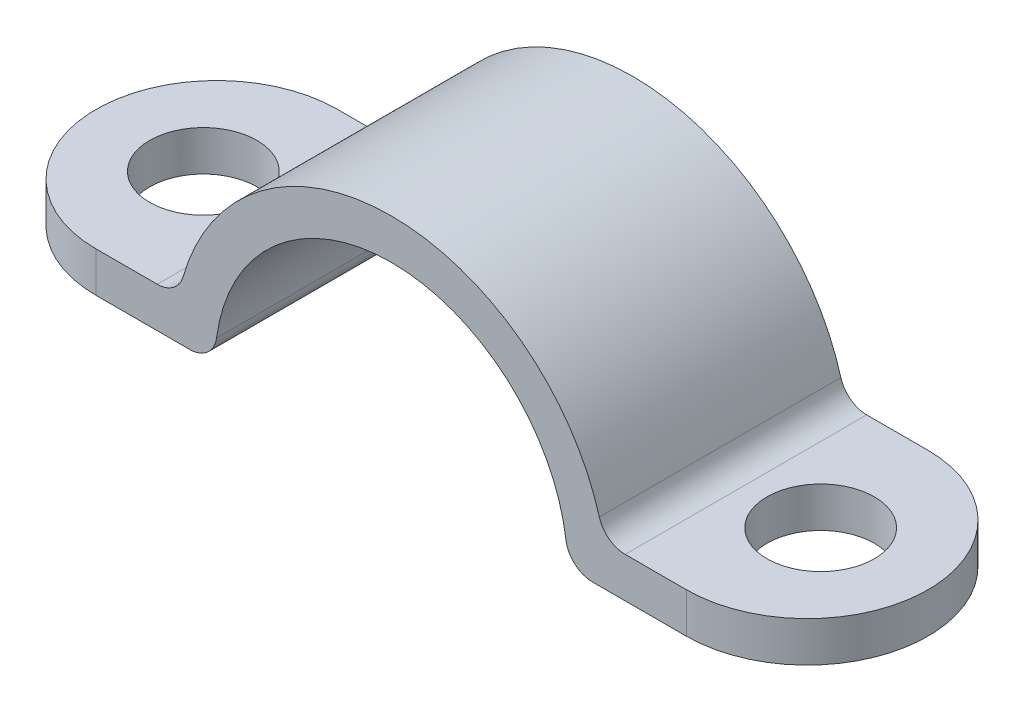
ISO-10303-21;
HEADER;
FILE_DESCRIPTION(('STEP AP214'),'2;1');
FILE_NAME('part.step','',(''),(''),'','','');
FILE_SCHEMA(('AUTOMOTIVE_DESIGN { 1 0 10303 214 1 1 1 1 }'));
ENDSEC;
DATA;
#1=APPLICATION_CONTEXT('core data for automotive mechanical design processes');
#2=APPLICATION_PROTOCOL_DEFINITION('international standard','automotive_design',2000,#1);
#3=PRODUCT_CONTEXT('',#1,'mechanical');
#4=PRODUCT('Part','Part','',(#3));
#5=PRODUCT_RELATED_PRODUCT_CATEGORY('part','',(#4));
#6=PRODUCT_DEFINITION_FORMATION('','',#4);
#7=PRODUCT_DEFINITION_CONTEXT('part definition',#1,'design');
#8=PRODUCT_DEFINITION('design','',#6,#7);
#9=PRODUCT_DEFINITION_SHAPE('','',#8);
#10=(LENGTH_UNIT() NAMED_UNIT(*) SI_UNIT(.MILLI.,.METRE.));
#11=(NAMED_UNIT(*) PLANE_ANGLE_UNIT() SI_UNIT($,.RADIAN.));
#12=(NAMED_UNIT(*) SI_UNIT($,.STERADIAN.) SOLID_ANGLE_UNIT());
#13=UNCERTAINTY_MEASURE_WITH_UNIT(LENGTH_MEASURE(1.E-05),#10,'distance_accuracy_value','');
#14=(GEOMETRIC_REPRESENTATION_CONTEXT(3) GLOBAL_UNCERTAINTY_ASSIGNED_CONTEXT((#13)) GLOBAL_UNIT_ASSIGNED_CONTEXT((#10,
#11,#12)) REPRESENTATION_CONTEXT('',''));
#15=CARTESIAN_POINT('',(0.,0.,0.));
#16=DIRECTION('',(0.,0.,1.));
#17=DIRECTION('',(1.,0.,0.));
#18=AXIS2_PLACEMENT_3D('',#15,#16,#17);
#19=CARTESIAN_POINT('',(22.,0.,9.));
#20=DIRECTION('',(0.,1.,0.));
#21=DIRECTION('',(0.,0.,1.));
#22=AXIS2_PLACEMENT_3D('',#19,#20,#21);
#23=CYLINDRICAL_SURFACE('',#22,9.);
#24=DIRECTION('',(0.,1.,0.));
#25=VECTOR('',#24,1.);
#26=CARTESIAN_POINT('',(22.,5.,18.));
#27=LINE('',#26,#25);
#28=CARTESIAN_POINT('',(22.,0.,18.));
#29=VERTEX_POINT('',#28);
#30=CARTESIAN_POINT('',(22.,3.,18.));
#31=VERTEX_POINT('',#30);
#32=EDGE_CURVE('E165',#29,#31,#27,.T.);
#33=ORIENTED_EDGE('',*,*,#32,.F.);
#34=CARTESIAN_POINT('',(22.,0.,9.));
#35=DIRECTION('',(0.,-1.,0.));
#36=DIRECTION('',(1.,0.,0.));
#37=AXIS2_PLACEMENT_3D('',#34,#35,#36);
#38=CIRCLE('',#37,9.);
#39=CARTESIAN_POINT('',(22.,0.,0.));
#40=VERTEX_POINT('',#39);
#41=EDGE_CURVE('E46',#40,#29,#38,.T.);
#42=ORIENTED_EDGE('',*,*,#41,.F.);
#43=DIRECTION('',(0.,-1.,0.));
#44=VECTOR('',#43,1.);
#45=CARTESIAN_POINT('',(22.,0.,0.));
#46=LINE('',#45,#44);
#47=CARTESIAN_POINT('',(22.,3.,0.));
#48=VERTEX_POINT('',#47);
#49=EDGE_CURVE('E167',#48,#40,#46,.T.);
#50=ORIENTED_EDGE('',*,*,#49,.F.);
#51=CARTESIAN_POINT('',(22.,3.,9.));
#52=DIRECTION('',(0.,-1.,0.));
#53=DIRECTION('',(1.,0.,0.));
#54=AXIS2_PLACEMENT_3D('',#51,#52,#53);
#55=CIRCLE('',#54,9.);
#56=EDGE_CURVE('E11',#31,#48,#55,.F.);
#57=ORIENTED_EDGE('',*,*,#56,.F.);
#58=EDGE_LOOP('',(#33,#42,#50,#57));
#59=FACE_BOUND('',#58,.T.);
#60=ADVANCED_FACE('F38',(#59),#23,.T.);
#61=CARTESIAN_POINT('',(-22.,0.,9.));
#62=DIRECTION('',(0.,1.,0.));
#63=DIRECTION('',(0.,0.,1.));
#64=AXIS2_PLACEMENT_3D('',#61,#62,#63);
#65=CYLINDRICAL_SURFACE('',#64,9.);
#66=DIRECTION('',(0.,1.,0.));
#67=VECTOR('',#66,1.);
#68=CARTESIAN_POINT('',(-22.,5.,0.));
#69=LINE('',#68,#67);
#70=CARTESIAN_POINT('',(-22.,0.,0.));
#71=VERTEX_POINT('',#70);
#72=CARTESIAN_POINT('',(-22.,3.,0.));
#73=VERTEX_POINT('',#72);
#74=EDGE_CURVE('E150',#71,#73,#69,.T.);
#75=ORIENTED_EDGE('',*,*,#74,.F.);
#76=CARTESIAN_POINT('',(-22.,0.,9.));
#77=DIRECTION('',(0.,-1.,0.));
#78=DIRECTION('',(0.,0.,-1.));
#79=AXIS2_PLACEMENT_3D('',#76,#77,#78);
#80=CIRCLE('',#79,9.);
#81=CARTESIAN_POINT('',(-22.,0.,18.));
#82=VERTEX_POINT('',#81);
#83=EDGE_CURVE('E161',#82,#71,#80,.T.);
#84=ORIENTED_EDGE('',*,*,#83,.F.);
#85=DIRECTION('',(0.,-1.,0.));
#86=VECTOR('',#85,1.);
#87=CARTESIAN_POINT('',(-22.,0.,18.));
#88=LINE('',#87,#86);
#89=CARTESIAN_POINT('',(-22.,3.,18.));
#90=VERTEX_POINT('',#89);
#91=EDGE_CURVE('E153',#90,#82,#88,.T.);
#92=ORIENTED_EDGE('',*,*,#91,.F.);
#93=CARTESIAN_POINT('',(-22.,3.,9.));
#94=DIRECTION('',(0.,-1.,0.));
#95=DIRECTION('',(1.,0.,0.));
#96=AXIS2_PLACEMENT_3D('',#93,#94,#95);
#97=CIRCLE('',#96,9.);
#98=EDGE_CURVE('E163',#73,#90,#97,.F.);
#99=ORIENTED_EDGE('',*,*,#98,.F.);
#100=EDGE_LOOP('',(#75,#84,#92,#99));
#101=FACE_BOUND('',#100,.T.);
#102=ADVANCED_FACE('F234',(#101),#65,.T.);
#103=CARTESIAN_POINT('',(17.4297583374678,5.,18.));
#104=DIRECTION('',(0.,0.,-1.));
#105=DIRECTION('',(-1.,0.,0.));
#106=AXIS2_PLACEMENT_3D('',#103,#104,#105);
#107=CYLINDRICAL_SURFACE('',#106,2.);
#108=CARTESIAN_POINT('',(17.4297583374678,5.,0.));
#109=DIRECTION('',(0.,0.,-1.));
#110=DIRECTION('',(-1.,0.,0.));
#111=AXIS2_PLACEMENT_3D('',#108,#109,#110);
#112=CIRCLE('',#111,2.);
#113=CARTESIAN_POINT('',(17.4297583374678,3.,0.));
#114=VERTEX_POINT('',#113);
#115=CARTESIAN_POINT('',(15.5072962475975,4.44851154770811,0.));
#116=VERTEX_POINT('',#115);
#117=EDGE_CURVE('E149',#114,#116,#112,.T.);
#118=ORIENTED_EDGE('',*,*,#117,.T.);
#119=DIRECTION('',(0.,0.,-1.));
#120=VECTOR('',#119,1.);
#121=CARTESIAN_POINT('',(15.5072962475975,4.44851154770811,18.));
#122=LINE('',#121,#120);
#123=CARTESIAN_POINT('',(15.5072962475975,4.44851154770811,18.));
#124=VERTEX_POINT('',#123);
#125=EDGE_CURVE('E128',#124,#116,#122,.T.);
#126=ORIENTED_EDGE('',*,*,#125,.F.);
#127=CARTESIAN_POINT('',(17.4297583374678,5.,18.));
#128=DIRECTION('',(0.,0.,-1.));
#129=DIRECTION('',(-1.,0.,0.));
#130=AXIS2_PLACEMENT_3D('',#127,#128,#129);
#131=CIRCLE('',#130,2.);
#132=CARTESIAN_POINT('',(17.4297583374678,3.,18.));
#133=VERTEX_POINT('',#132);
#134=EDGE_CURVE('E135',#133,#124,#131,.T.);
#135=ORIENTED_EDGE('',*,*,#134,.F.);
#136=DIRECTION('',(0.,0.,-1.));
#137=VECTOR('',#136,1.);
#138=CARTESIAN_POINT('',(17.4297583374678,3.,18.));
#139=LINE('',#138,#137);
#140=EDGE_CURVE('E180',#133,#114,#139,.T.);
#141=ORIENTED_EDGE('',*,*,#140,.T.);
#142=EDGE_LOOP('',(#118,#126,#135,#141));
#143=FACE_BOUND('',#142,.T.);
#144=ADVANCED_FACE('F147',(#143),#107,.F.);
#145=CARTESIAN_POINT('',(0.,0.,18.));
#146=DIRECTION('',(0.,0.,-1.));
#147=DIRECTION('',(-1.,0.,0.));
#148=AXIS2_PLACEMENT_3D('',#145,#146,#147);
#149=CYLINDRICAL_SURFACE('',#148,16.1327459504216);
#150=CARTESIAN_POINT('',(0.,0.,0.));
#151=DIRECTION('',(0.,0.,1.));
#152=DIRECTION('',(1.,0.,0.));
#153=AXIS2_PLACEMENT_3D('',#150,#151,#152);
#154=CIRCLE('',#153,16.1327459504216);
#155=CARTESIAN_POINT('',(-15.5072962475975,4.44851154770811,0.));
#156=VERTEX_POINT('',#155);
#157=EDGE_CURVE('E187',#116,#156,#154,.T.);
#158=ORIENTED_EDGE('',*,*,#157,.T.);
#159=DIRECTION('',(0.,0.,-1.));
#160=VECTOR('',#159,1.);
#161=CARTESIAN_POINT('',(-15.5072962475975,4.44851154770811,18.));
#162=LINE('',#161,#160);
#163=CARTESIAN_POINT('',(-15.5072962475975,4.44851154770811,18.));
#164=VERTEX_POINT('',#163);
#165=EDGE_CURVE('E131',#164,#156,#162,.T.);
#166=ORIENTED_EDGE('',*,*,#165,.F.);
#167=CARTESIAN_POINT('',(0.,0.,18.));
#168=DIRECTION('',(0.,0.,1.));
#169=DIRECTION('',(1.,0.,0.));
#170=AXIS2_PLACEMENT_3D('',#167,#168,#169);
#171=CIRCLE('',#170,16.1327459504216);
#172=EDGE_CURVE('E124',#124,#164,#171,.T.);
#173=ORIENTED_EDGE('',*,*,#172,.F.);
#174=ORIENTED_EDGE('',*,*,#125,.T.);
#175=EDGE_LOOP('',(#158,#166,#173,#174));
#176=FACE_BOUND('',#175,.T.);
#177=ADVANCED_FACE('F126',(#176),#149,.T.);
#178=CARTESIAN_POINT('',(-17.4297583374678,5.,18.));
#179=DIRECTION('',(0.,0.,-1.));
#180=DIRECTION('',(-1.,0.,0.));
#181=AXIS2_PLACEMENT_3D('',#178,#179,#180);
#182=CYLINDRICAL_SURFACE('',#181,2.);
#183=CARTESIAN_POINT('',(-17.4297583374678,5.,0.));
#184=DIRECTION('',(0.,0.,-1.));
#185=DIRECTION('',(-1.,0.,0.));
#186=AXIS2_PLACEMENT_3D('',#183,#184,#185);
#187=CIRCLE('',#186,2.);
#188=CARTESIAN_POINT('',(-17.4297583374678,3.,0.));
#189=VERTEX_POINT('',#188);
#190=EDGE_CURVE('E190',#156,#189,#187,.T.);
#191=ORIENTED_EDGE('',*,*,#190,.T.);
#192=DIRECTION('',(0.,0.,-1.));
#193=VECTOR('',#192,1.);
#194=CARTESIAN_POINT('',(-17.4297583374678,3.,18.));
#195=LINE('',#194,#193);
#196=CARTESIAN_POINT('',(-17.4297583374678,3.,18.));
#197=VERTEX_POINT('',#196);
#198=EDGE_CURVE('E155',#197,#189,#195,.T.);
#199=ORIENTED_EDGE('',*,*,#198,.F.);
#200=CARTESIAN_POINT('',(-17.4297583374678,5.,18.));
#201=DIRECTION('',(0.,0.,-1.));
#202=DIRECTION('',(-1.,0.,0.));
#203=AXIS2_PLACEMENT_3D('',#200,#201,#202);
#204=CIRCLE('',#203,2.);
#205=EDGE_CURVE('E134',#164,#197,#204,.T.);
#206=ORIENTED_EDGE('',*,*,#205,.F.);
#207=ORIENTED_EDGE('',*,*,#165,.T.);
#208=EDGE_LOOP('',(#191,#199,#206,#207));
#209=FACE_BOUND('',#208,.T.);
#210=ADVANCED_FACE('F280',(#209),#182,.F.);
#211=CARTESIAN_POINT('',(-17.4297583374678,3.,18.));
#212=DIRECTION('',(0.,-1.,0.));
#213=DIRECTION('',(1.,0.,0.));
#214=AXIS2_PLACEMENT_3D('',#211,#212,#213);
#215=PLANE('',#214);
#216=CARTESIAN_POINT('',(-23.,3.,9.00000000000001));
#217=DIRECTION('',(0.,1.,0.));
#218=DIRECTION('',(-1.,0.,0.));
#219=AXIS2_PLACEMENT_3D('',#216,#217,#218);
#220=CIRCLE('',#219,4.);
#221=CARTESIAN_POINT('',(-27.,3.,9.00000000000001));
#222=VERTEX_POINT('',#221);
#223=EDGE_CURVE('E188',#222,#222,#220,.T.);
#224=ORIENTED_EDGE('',*,*,#223,.F.);
#225=EDGE_LOOP('',(#224));
#226=FACE_BOUND('',#225,.T.);
#227=DIRECTION('',(-1.,0.,0.));
#228=VECTOR('',#227,1.);
#229=CARTESIAN_POINT('',(-17.4297583374678,3.,0.));
#230=LINE('',#229,#228);
#231=EDGE_CURVE('E192',#189,#73,#230,.T.);
#232=ORIENTED_EDGE('',*,*,#231,.T.);
#233=ORIENTED_EDGE('',*,*,#98,.T.);
#234=DIRECTION('',(-1.,0.,0.));
#235=VECTOR('',#234,1.);
#236=CARTESIAN_POINT('',(-17.4297583374678,3.,18.));
#237=LINE('',#236,#235);
#238=EDGE_CURVE('E224',#197,#90,#237,.T.);
#239=ORIENTED_EDGE('',*,*,#238,.F.);
#240=ORIENTED_EDGE('',*,*,#198,.T.);
#241=EDGE_LOOP('',(#232,#233,#239,#240));
#242=FACE_BOUND('',#241,.T.);
#243=ADVANCED_FACE('F222',(#226,#242),#215,.F.);
#244=CARTESIAN_POINT('',(-15.,0.,18.));
#245=DIRECTION('',(0.,-1.,0.));
#246=DIRECTION('',(0.,0.,-1.));
#247=AXIS2_PLACEMENT_3D('',#244,#245,#246);
#248=PLANE('',#247);
#249=CARTESIAN_POINT('',(-23.,0.,9.00000000000001));
#250=DIRECTION('',(0.,-1.,0.));
#251=DIRECTION('',(0.,0.,-1.));
#252=AXIS2_PLACEMENT_3D('',#249,#250,#251);
#253=CIRCLE('',#252,4.);
#254=CARTESIAN_POINT('',(-23.,0.,5.00000000000001));
#255=VERTEX_POINT('',#254);
#256=EDGE_CURVE('E399',#255,#255,#253,.F.);
#257=ORIENTED_EDGE('',*,*,#256,.T.);
#258=EDGE_LOOP('',(#257));
#259=FACE_BOUND('',#258,.T.);
#260=DIRECTION('',(-1.,0.,0.));
#261=VECTOR('',#260,1.);
#262=CARTESIAN_POINT('',(-15.,0.,18.));
#263=LINE('',#262,#261);
#264=CARTESIAN_POINT('',(-15.,0.,18.));
#265=VERTEX_POINT('',#264);
#266=EDGE_CURVE('E238',#265,#82,#263,.T.);
#267=ORIENTED_EDGE('',*,*,#266,.T.);
#268=ORIENTED_EDGE('',*,*,#83,.T.);
#269=DIRECTION('',(-1.,0.,0.));
#270=VECTOR('',#269,1.);
#271=CARTESIAN_POINT('',(-15.,0.,0.));
#272=LINE('',#271,#270);
#273=CARTESIAN_POINT('',(-15.,0.,0.));
#274=VERTEX_POINT('',#273);
#275=EDGE_CURVE('E195',#274,#71,#272,.T.);
#276=ORIENTED_EDGE('',*,*,#275,.F.);
#277=DIRECTION('',(0.,0.,-1.));
#278=VECTOR('',#277,1.);
#279=CARTESIAN_POINT('',(-15.,0.,18.));
#280=LINE('',#279,#278);
#281=EDGE_CURVE('E216',#265,#274,#280,.T.);
#282=ORIENTED_EDGE('',*,*,#281,.F.);
#283=EDGE_LOOP('',(#267,#268,#276,#282));
#284=FACE_BOUND('',#283,.T.);
#285=ADVANCED_FACE('F285',(#259,#284),#248,.T.);
#286=CARTESIAN_POINT('',(-15.,2.,18.));
#287=DIRECTION('',(0.,0.,-1.));
#288=DIRECTION('',(-1.,0.,0.));
#289=AXIS2_PLACEMENT_3D('',#286,#287,#288);
#290=CYLINDRICAL_SURFACE('',#289,2.);
#291=CARTESIAN_POINT('',(-15.,2.,0.));
#292=DIRECTION('',(0.,0.,1.));
#293=DIRECTION('',(1.,0.,0.));
#294=AXIS2_PLACEMENT_3D('',#291,#292,#293);
#295=CIRCLE('',#294,2.);
#296=CARTESIAN_POINT('',(-13.0175441986347,1.73567255981796,0.));
#297=VERTEX_POINT('',#296);
#298=EDGE_CURVE('E198',#274,#297,#295,.T.);
#299=ORIENTED_EDGE('',*,*,#298,.T.);
#300=DIRECTION('',(0.,0.,-1.));
#301=VECTOR('',#300,1.);
#302=CARTESIAN_POINT('',(-13.0175441986347,1.73567255981796,18.));
#303=LINE('',#302,#301);
#304=CARTESIAN_POINT('',(-13.0175441986347,1.73567255981796,18.));
#305=VERTEX_POINT('',#304);
#306=EDGE_CURVE('E214',#305,#297,#303,.T.);
#307=ORIENTED_EDGE('',*,*,#306,.F.);
#308=CARTESIAN_POINT('',(-15.,2.,18.));
#309=DIRECTION('',(0.,0.,1.));
#310=DIRECTION('',(1.,0.,0.));
#311=AXIS2_PLACEMENT_3D('',#308,#309,#310);
#312=CIRCLE('',#311,2.);
#313=EDGE_CURVE('E240',#265,#305,#312,.T.);
#314=ORIENTED_EDGE('',*,*,#313,.F.);
#315=ORIENTED_EDGE('',*,*,#281,.T.);
#316=EDGE_LOOP('',(#299,#307,#314,#315));
#317=FACE_BOUND('',#316,.T.);
#318=ADVANCED_FACE('F289',(#317),#290,.T.);
#319=CARTESIAN_POINT('',(0.,0.,18.));
#320=DIRECTION('',(0.,0.,-1.));
#321=DIRECTION('',(-1.,0.,0.));
#322=AXIS2_PLACEMENT_3D('',#319,#320,#321);
#323=CYLINDRICAL_SURFACE('',#322,13.1327459504216);
#324=CARTESIAN_POINT('',(0.,0.,0.));
#325=DIRECTION('',(0.,0.,1.));
#326=DIRECTION('',(1.,0.,0.));
#327=AXIS2_PLACEMENT_3D('',#324,#325,#326);
#328=CIRCLE('',#327,13.1327459504216);
#329=CARTESIAN_POINT('',(13.0175441986347,1.73567255981796,0.));
#330=VERTEX_POINT('',#329);
#331=EDGE_CURVE('E201',#330,#297,#328,.T.);
#332=ORIENTED_EDGE('',*,*,#331,.F.);
#333=DIRECTION('',(0.,0.,-1.));
#334=VECTOR('',#333,1.);
#335=CARTESIAN_POINT('',(13.0175441986347,1.73567255981796,18.));
#336=LINE('',#335,#334);
#337=CARTESIAN_POINT('',(13.0175441986347,1.73567255981796,18.));
#338=VERTEX_POINT('',#337);
#339=EDGE_CURVE('E212',#338,#330,#336,.T.);
#340=ORIENTED_EDGE('',*,*,#339,.F.);
#341=CARTESIAN_POINT('',(0.,0.,18.));
#342=DIRECTION('',(0.,0.,1.));
#343=DIRECTION('',(1.,0.,0.));
#344=AXIS2_PLACEMENT_3D('',#341,#342,#343);
#345=CIRCLE('',#344,13.1327459504216);
#346=EDGE_CURVE('E182',#338,#305,#345,.T.);
#347=ORIENTED_EDGE('',*,*,#346,.T.);
#348=ORIENTED_EDGE('',*,*,#306,.T.);
#349=EDGE_LOOP('',(#332,#340,#347,#348));
#350=FACE_BOUND('',#349,.T.);
#351=ADVANCED_FACE('F247',(#350),#323,.F.);
#352=CARTESIAN_POINT('',(15.,2.,18.));
#353=DIRECTION('',(0.,0.,-1.));
#354=DIRECTION('',(-1.,0.,0.));
#355=AXIS2_PLACEMENT_3D('',#352,#353,#354);
#356=CYLINDRICAL_SURFACE('',#355,2.);
#357=CARTESIAN_POINT('',(15.,2.,0.));
#358=DIRECTION('',(0.,0.,-1.));
#359=DIRECTION('',(-1.,0.,0.));
#360=AXIS2_PLACEMENT_3D('',#357,#358,#359);
#361=CIRCLE('',#360,2.);
#362=CARTESIAN_POINT('',(15.,0.,0.));
#363=VERTEX_POINT('',#362);
#364=EDGE_CURVE('E204',#363,#330,#361,.T.);
#365=ORIENTED_EDGE('',*,*,#364,.F.);
#366=DIRECTION('',(0.,0.,-1.));
#367=VECTOR('',#366,1.);
#368=CARTESIAN_POINT('',(15.,0.,18.));
#369=LINE('',#368,#367);
#370=CARTESIAN_POINT('',(15.,0.,18.));
#371=VERTEX_POINT('',#370);
#372=EDGE_CURVE('E210',#371,#363,#369,.T.);
#373=ORIENTED_EDGE('',*,*,#372,.F.);
#374=CARTESIAN_POINT('',(15.,2.,18.));
#375=DIRECTION('',(0.,0.,-1.));
#376=DIRECTION('',(-1.,0.,0.));
#377=AXIS2_PLACEMENT_3D('',#374,#375,#376);
#378=CIRCLE('',#377,2.);
#379=EDGE_CURVE('E178',#371,#338,#378,.T.);
#380=ORIENTED_EDGE('',*,*,#379,.T.);
#381=ORIENTED_EDGE('',*,*,#339,.T.);
#382=EDGE_LOOP('',(#365,#373,#380,#381));
#383=FACE_BOUND('',#382,.T.);
#384=ADVANCED_FACE('F252',(#383),#356,.T.);
#385=CARTESIAN_POINT('',(31.,0.,18.));
#386=DIRECTION('',(0.,-1.,0.));
#387=DIRECTION('',(1.,0.,0.));
#388=AXIS2_PLACEMENT_3D('',#385,#386,#387);
#389=PLANE('',#388);
#390=CARTESIAN_POINT('',(23.,0.,9.));
#391=DIRECTION('',(0.,-1.,0.));
#392=DIRECTION('',(1.,0.,0.));
#393=AXIS2_PLACEMENT_3D('',#390,#391,#392);
#394=CIRCLE('',#393,4.);
#395=CARTESIAN_POINT('',(27.,0.,9.));
#396=VERTEX_POINT('',#395);
#397=EDGE_CURVE('E408',#396,#396,#394,.F.);
#398=ORIENTED_EDGE('',*,*,#397,.T.);
#399=EDGE_LOOP('',(#398));
#400=FACE_BOUND('',#399,.T.);
#401=DIRECTION('',(-1.,0.,0.));
#402=VECTOR('',#401,1.);
#403=CARTESIAN_POINT('',(31.,0.,0.));
#404=LINE('',#403,#402);
#405=EDGE_CURVE('E174',#40,#363,#404,.T.);
#406=ORIENTED_EDGE('',*,*,#405,.F.);
#407=ORIENTED_EDGE('',*,*,#41,.T.);
#408=DIRECTION('',(-1.,0.,0.));
#409=VECTOR('',#408,1.);
#410=CARTESIAN_POINT('',(31.,0.,18.));
#411=LINE('',#410,#409);
#412=EDGE_CURVE('E172',#29,#371,#411,.T.);
#413=ORIENTED_EDGE('',*,*,#412,.T.);
#414=ORIENTED_EDGE('',*,*,#372,.T.);
#415=EDGE_LOOP('',(#406,#407,#413,#414));
#416=FACE_BOUND('',#415,.T.);
#417=ADVANCED_FACE('F170',(#400,#416),#389,.T.);
#418=CARTESIAN_POINT('',(31.,3.,18.));
#419=DIRECTION('',(0.,-1.,0.));
#420=DIRECTION('',(1.,0.,0.));
#421=AXIS2_PLACEMENT_3D('',#418,#419,#420);
#422=PLANE('',#421);
#423=CARTESIAN_POINT('',(23.,3.,9.));
#424=DIRECTION('',(0.,1.,0.));
#425=DIRECTION('',(-1.,0.,0.));
#426=AXIS2_PLACEMENT_3D('',#423,#424,#425);
#427=CIRCLE('',#426,4.);
#428=CARTESIAN_POINT('',(19.,3.,9.));
#429=VERTEX_POINT('',#428);
#430=EDGE_CURVE('E403',#429,#429,#427,.T.);
#431=ORIENTED_EDGE('',*,*,#430,.F.);
#432=EDGE_LOOP('',(#431));
#433=FACE_BOUND('',#432,.T.);
#434=DIRECTION('',(-1.,0.,0.));
#435=VECTOR('',#434,1.);
#436=CARTESIAN_POINT('',(31.,3.,18.));
#437=LINE('',#436,#435);
#438=EDGE_CURVE('E141',#31,#133,#437,.T.);
#439=ORIENTED_EDGE('',*,*,#438,.F.);
#440=ORIENTED_EDGE('',*,*,#56,.T.);
#441=DIRECTION('',(-1.,0.,0.));
#442=VECTOR('',#441,1.);
#443=CARTESIAN_POINT('',(31.,3.,0.));
#444=LINE('',#443,#442);
#445=EDGE_CURVE('E145',#48,#114,#444,.T.);
#446=ORIENTED_EDGE('',*,*,#445,.T.);
#447=ORIENTED_EDGE('',*,*,#140,.F.);
#448=EDGE_LOOP('',(#439,#440,#446,#447));
#449=FACE_BOUND('',#448,.T.);
#450=ADVANCED_FACE('F253',(#433,#449),#422,.F.);
#451=CARTESIAN_POINT('',(17.4297583374678,5.,18.));
#452=DIRECTION('',(0.,0.,-1.));
#453=DIRECTION('',(-1.,0.,0.));
#454=AXIS2_PLACEMENT_3D('',#451,#452,#453);
#455=PLANE('',#454);
#456=ORIENTED_EDGE('',*,*,#412,.F.);
#457=ORIENTED_EDGE('',*,*,#32,.T.);
#458=ORIENTED_EDGE('',*,*,#438,.T.);
#459=ORIENTED_EDGE('',*,*,#134,.T.);
#460=ORIENTED_EDGE('',*,*,#172,.T.);
#461=ORIENTED_EDGE('',*,*,#205,.T.);
#462=ORIENTED_EDGE('',*,*,#238,.T.);
#463=ORIENTED_EDGE('',*,*,#91,.T.);
#464=ORIENTED_EDGE('',*,*,#266,.F.);
#465=ORIENTED_EDGE('',*,*,#313,.T.);
#466=ORIENTED_EDGE('',*,*,#346,.F.);
#467=ORIENTED_EDGE('',*,*,#379,.F.);
#468=EDGE_LOOP('',(#456,#457,#458,#459,#460,#461,#462,#463,#464,#465,#466,#467));
#469=FACE_BOUND('',#468,.T.);
#470=ADVANCED_FACE('F139',(#469),#455,.F.);
#471=CARTESIAN_POINT('',(17.4297583374678,5.,0.));
#472=DIRECTION('',(0.,0.,-1.));
#473=DIRECTION('',(-1.,0.,0.));
#474=AXIS2_PLACEMENT_3D('',#471,#472,#473);
#475=PLANE('',#474);
#476=ORIENTED_EDGE('',*,*,#445,.F.);
#477=ORIENTED_EDGE('',*,*,#49,.T.);
#478=ORIENTED_EDGE('',*,*,#405,.T.);
#479=ORIENTED_EDGE('',*,*,#364,.T.);
#480=ORIENTED_EDGE('',*,*,#331,.T.);
#481=ORIENTED_EDGE('',*,*,#298,.F.);
#482=ORIENTED_EDGE('',*,*,#275,.T.);
#483=ORIENTED_EDGE('',*,*,#74,.T.);
#484=ORIENTED_EDGE('',*,*,#231,.F.);
#485=ORIENTED_EDGE('',*,*,#190,.F.);
#486=ORIENTED_EDGE('',*,*,#157,.F.);
#487=ORIENTED_EDGE('',*,*,#117,.F.);
#488=EDGE_LOOP('',(#476,#477,#478,#479,#480,#481,#482,#483,#484,#485,#486,#487));
#489=FACE_BOUND('',#488,.T.);
#490=ADVANCED_FACE('F229',(#489),#475,.T.);
#491=CARTESIAN_POINT('',(23.,-0.00100000000000143,9.));
#492=DIRECTION('',(0.,1.,0.));
#493=DIRECTION('',(-1.,0.,0.));
#494=AXIS2_PLACEMENT_3D('',#491,#492,#493);
#495=CYLINDRICAL_SURFACE('',#494,4.);
#496=ORIENTED_EDGE('',*,*,#397,.F.);
#497=EDGE_LOOP('',(#496));
#498=FACE_BOUND('',#497,.T.);
#499=ORIENTED_EDGE('',*,*,#430,.T.);
#500=EDGE_LOOP('',(#499));
#501=FACE_BOUND('',#500,.T.);
#502=ADVANCED_FACE('F327',(#498,#501),#495,.F.);
#503=CARTESIAN_POINT('',(-23.,-0.00100000000000664,9.00000000000001));
#504=DIRECTION('',(0.,1.,0.));
#505=DIRECTION('',(-1.,0.,0.));
#506=AXIS2_PLACEMENT_3D('',#503,#504,#505);
#507=CYLINDRICAL_SURFACE('',#506,4.);
#508=ORIENTED_EDGE('',*,*,#256,.F.);
#509=EDGE_LOOP('',(#508));
#510=FACE_BOUND('',#509,.T.);
#511=ORIENTED_EDGE('',*,*,#223,.T.);
#512=EDGE_LOOP('',(#511));
#513=FACE_BOUND('',#512,.T.);
#514=ADVANCED_FACE('F335',(#510,#513),#507,.F.);
#515=CLOSED_SHELL('',(#60,#102,#144,#177,#210,#243,#285,#318,#351,#384,#417,#450,#470,#490,#502,#514));
#516=MANIFOLD_SOLID_BREP('B2',#515);
#517=ADVANCED_BREP_SHAPE_REPRESENTATION('',(#18,#516),#14);
#518=SHAPE_DEFINITION_REPRESENTATION(#9,#517);
ENDSEC;
END-ISO-10303-21;
